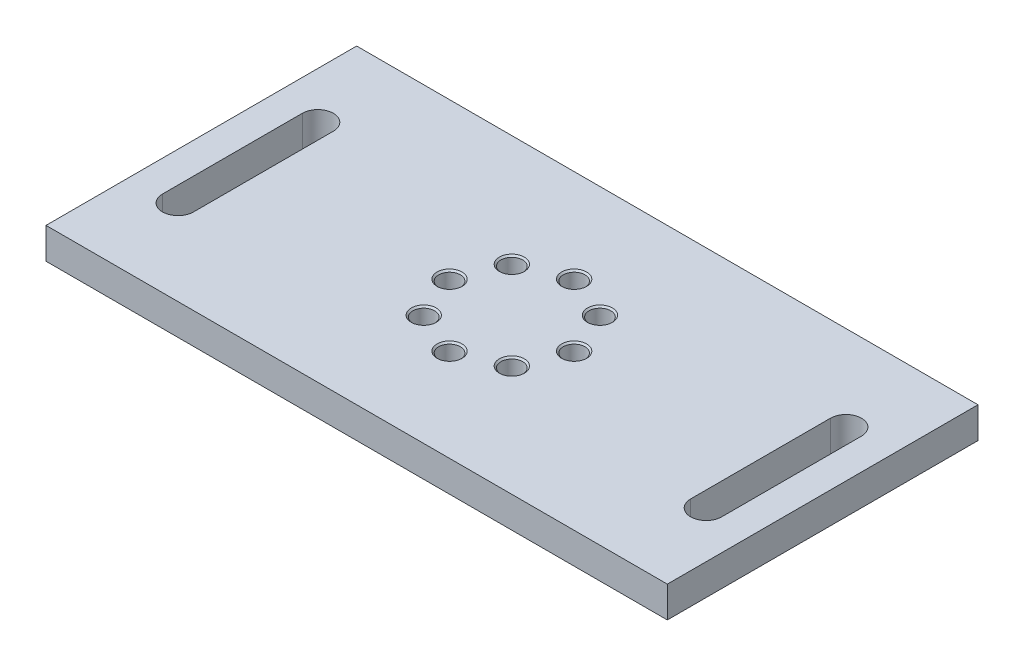
ISO-10303-21;
HEADER;
FILE_DESCRIPTION(('STEP AP214'),'2;1');
FILE_NAME('part.step','',(''),(''),'','','');
FILE_SCHEMA(('AUTOMOTIVE_DESIGN { 1 0 10303 214 1 1 1 1 }'));
ENDSEC;
DATA;
#1=APPLICATION_CONTEXT('core data for automotive mechanical design processes');
#2=APPLICATION_PROTOCOL_DEFINITION('international standard','automotive_design',2000,#1);
#3=PRODUCT_CONTEXT('',#1,'mechanical');
#4=PRODUCT('Part','Part','',(#3));
#5=PRODUCT_RELATED_PRODUCT_CATEGORY('part','',(#4));
#6=PRODUCT_DEFINITION_FORMATION('','',#4);
#7=PRODUCT_DEFINITION_CONTEXT('part definition',#1,'design');
#8=PRODUCT_DEFINITION('design','',#6,#7);
#9=PRODUCT_DEFINITION_SHAPE('','',#8);
#10=(LENGTH_UNIT() NAMED_UNIT(*) SI_UNIT(.MILLI.,.METRE.));
#11=(NAMED_UNIT(*) PLANE_ANGLE_UNIT() SI_UNIT($,.RADIAN.));
#12=(NAMED_UNIT(*) SI_UNIT($,.STERADIAN.) SOLID_ANGLE_UNIT());
#13=UNCERTAINTY_MEASURE_WITH_UNIT(LENGTH_MEASURE(1.E-05),#10,'distance_accuracy_value','');
#14=(GEOMETRIC_REPRESENTATION_CONTEXT(3) GLOBAL_UNCERTAINTY_ASSIGNED_CONTEXT((#13)) GLOBAL_UNIT_ASSIGNED_CONTEXT((#10,
#11,#12)) REPRESENTATION_CONTEXT('',''));
#15=CARTESIAN_POINT('',(0.,0.,0.));
#16=DIRECTION('',(0.,0.,1.));
#17=DIRECTION('',(1.,0.,0.));
#18=AXIS2_PLACEMENT_3D('',#15,#16,#17);
#19=CARTESIAN_POINT('',(0.,10.,0.));
#20=DIRECTION('',(1.,0.,0.));
#21=DIRECTION('',(0.,0.,-1.));
#22=AXIS2_PLACEMENT_3D('',#19,#20,#21);
#23=PLANE('',#22);
#24=DIRECTION('',(0.,0.,1.));
#25=VECTOR('',#24,1.);
#26=CARTESIAN_POINT('',(0.,0.,0.));
#27=LINE('',#26,#25);
#28=CARTESIAN_POINT('',(0.,0.,-100.));
#29=VERTEX_POINT('',#28);
#30=CARTESIAN_POINT('',(0.,0.,0.));
#31=VERTEX_POINT('',#30);
#32=EDGE_CURVE('E265',#29,#31,#27,.T.);
#33=ORIENTED_EDGE('',*,*,#32,.T.);
#34=DIRECTION('',(0.,-1.,0.));
#35=VECTOR('',#34,1.);
#36=CARTESIAN_POINT('',(0.,10.,0.));
#37=LINE('',#36,#35);
#38=CARTESIAN_POINT('',(0.,10.,0.));
#39=VERTEX_POINT('',#38);
#40=EDGE_CURVE('E11',#39,#31,#37,.T.);
#41=ORIENTED_EDGE('',*,*,#40,.F.);
#42=DIRECTION('',(0.,0.,1.));
#43=VECTOR('',#42,1.);
#44=CARTESIAN_POINT('',(0.,10.,0.));
#45=LINE('',#44,#43);
#46=CARTESIAN_POINT('',(0.,10.,-100.));
#47=VERTEX_POINT('',#46);
#48=EDGE_CURVE('E266',#47,#39,#45,.T.);
#49=ORIENTED_EDGE('',*,*,#48,.F.);
#50=DIRECTION('',(0.,-1.,0.));
#51=VECTOR('',#50,1.);
#52=CARTESIAN_POINT('',(0.,10.,-100.));
#53=LINE('',#52,#51);
#54=EDGE_CURVE('E276',#47,#29,#53,.T.);
#55=ORIENTED_EDGE('',*,*,#54,.T.);
#56=EDGE_LOOP('',(#33,#41,#49,#55));
#57=FACE_BOUND('',#56,.T.);
#58=ADVANCED_FACE('F36',(#57),#23,.F.);
#59=CARTESIAN_POINT('',(0.,10.,0.));
#60=DIRECTION('',(0.,0.,-1.));
#61=DIRECTION('',(-1.,0.,0.));
#62=AXIS2_PLACEMENT_3D('',#59,#60,#61);
#63=PLANE('',#62);
#64=DIRECTION('',(1.,0.,0.));
#65=VECTOR('',#64,1.);
#66=CARTESIAN_POINT('',(0.,0.,0.));
#67=LINE('',#66,#65);
#68=CARTESIAN_POINT('',(200.,0.,0.));
#69=VERTEX_POINT('',#68);
#70=EDGE_CURVE('E279',#31,#69,#67,.T.);
#71=ORIENTED_EDGE('',*,*,#70,.T.);
#72=DIRECTION('',(0.,-1.,0.));
#73=VECTOR('',#72,1.);
#74=CARTESIAN_POINT('',(200.,10.,0.));
#75=LINE('',#74,#73);
#76=CARTESIAN_POINT('',(200.,10.,0.));
#77=VERTEX_POINT('',#76);
#78=EDGE_CURVE('E43',#77,#69,#75,.T.);
#79=ORIENTED_EDGE('',*,*,#78,.F.);
#80=DIRECTION('',(1.,0.,0.));
#81=VECTOR('',#80,1.);
#82=CARTESIAN_POINT('',(0.,10.,0.));
#83=LINE('',#82,#81);
#84=EDGE_CURVE('E269',#39,#77,#83,.T.);
#85=ORIENTED_EDGE('',*,*,#84,.F.);
#86=ORIENTED_EDGE('',*,*,#40,.T.);
#87=EDGE_LOOP('',(#71,#79,#85,#86));
#88=FACE_BOUND('',#87,.T.);
#89=ADVANCED_FACE('F308',(#88),#63,.F.);
#90=CARTESIAN_POINT('',(200.,10.,0.));
#91=DIRECTION('',(-1.,0.,0.));
#92=DIRECTION('',(0.,0.,1.));
#93=AXIS2_PLACEMENT_3D('',#90,#91,#92);
#94=PLANE('',#93);
#95=DIRECTION('',(0.,0.,-1.));
#96=VECTOR('',#95,1.);
#97=CARTESIAN_POINT('',(200.,0.,0.));
#98=LINE('',#97,#96);
#99=CARTESIAN_POINT('',(200.,0.,-100.));
#100=VERTEX_POINT('',#99);
#101=EDGE_CURVE('E281',#69,#100,#98,.T.);
#102=ORIENTED_EDGE('',*,*,#101,.T.);
#103=DIRECTION('',(0.,-1.,0.));
#104=VECTOR('',#103,1.);
#105=CARTESIAN_POINT('',(200.,10.,-100.));
#106=LINE('',#105,#104);
#107=CARTESIAN_POINT('',(200.,10.,-100.));
#108=VERTEX_POINT('',#107);
#109=EDGE_CURVE('E286',#108,#100,#106,.T.);
#110=ORIENTED_EDGE('',*,*,#109,.F.);
#111=DIRECTION('',(0.,0.,-1.));
#112=VECTOR('',#111,1.);
#113=CARTESIAN_POINT('',(200.,10.,0.));
#114=LINE('',#113,#112);
#115=EDGE_CURVE('E272',#77,#108,#114,.T.);
#116=ORIENTED_EDGE('',*,*,#115,.F.);
#117=ORIENTED_EDGE('',*,*,#78,.T.);
#118=EDGE_LOOP('',(#102,#110,#116,#117));
#119=FACE_BOUND('',#118,.T.);
#120=ADVANCED_FACE('F293',(#119),#94,.F.);
#121=CARTESIAN_POINT('',(0.,10.,-100.));
#122=DIRECTION('',(0.,0.,1.));
#123=DIRECTION('',(1.,0.,0.));
#124=AXIS2_PLACEMENT_3D('',#121,#122,#123);
#125=PLANE('',#124);
#126=DIRECTION('',(-1.,0.,0.));
#127=VECTOR('',#126,1.);
#128=CARTESIAN_POINT('',(0.,0.,-100.));
#129=LINE('',#128,#127);
#130=EDGE_CURVE('E270',#100,#29,#129,.T.);
#131=ORIENTED_EDGE('',*,*,#130,.T.);
#132=ORIENTED_EDGE('',*,*,#54,.F.);
#133=DIRECTION('',(-1.,0.,0.));
#134=VECTOR('',#133,1.);
#135=CARTESIAN_POINT('',(0.,10.,-100.));
#136=LINE('',#135,#134);
#137=EDGE_CURVE('E274',#108,#47,#136,.T.);
#138=ORIENTED_EDGE('',*,*,#137,.F.);
#139=ORIENTED_EDGE('',*,*,#109,.T.);
#140=EDGE_LOOP('',(#131,#132,#138,#139));
#141=FACE_BOUND('',#140,.T.);
#142=ADVANCED_FACE('F301',(#141),#125,.F.);
#143=CARTESIAN_POINT('',(0.,10.,0.));
#144=DIRECTION('',(0.,-1.,0.));
#145=DIRECTION('',(0.,0.,-1.));
#146=AXIS2_PLACEMENT_3D('',#143,#144,#145);
#147=PLANE('',#146);
#148=DIRECTION('',(0.,0.,1.));
#149=VECTOR('',#148,1.);
#150=CARTESIAN_POINT('',(10.,10.,-72.5));
#151=LINE('',#150,#149);
#152=CARTESIAN_POINT('',(10.,10.,-72.5));
#153=VERTEX_POINT('',#152);
#154=CARTESIAN_POINT('',(10.,10.,-27.5));
#155=VERTEX_POINT('',#154);
#156=EDGE_CURVE('E154',#153,#155,#151,.T.);
#157=ORIENTED_EDGE('',*,*,#156,.F.);
#158=CARTESIAN_POINT('',(15.,10.,-72.5));
#159=DIRECTION('',(0.,1.,0.));
#160=DIRECTION('',(0.,0.,1.));
#161=AXIS2_PLACEMENT_3D('',#158,#159,#160);
#162=CIRCLE('',#161,5.);
#163=CARTESIAN_POINT('',(20.,10.,-72.5));
#164=VERTEX_POINT('',#163);
#165=EDGE_CURVE('E50',#164,#153,#162,.T.);
#166=ORIENTED_EDGE('',*,*,#165,.F.);
#167=DIRECTION('',(0.,0.,-1.));
#168=VECTOR('',#167,1.);
#169=CARTESIAN_POINT('',(20.,10.,-72.5));
#170=LINE('',#169,#168);
#171=CARTESIAN_POINT('',(20.,10.,-27.5));
#172=VERTEX_POINT('',#171);
#173=EDGE_CURVE('E145',#172,#164,#170,.T.);
#174=ORIENTED_EDGE('',*,*,#173,.F.);
#175=CARTESIAN_POINT('',(15.,10.,-27.5));
#176=DIRECTION('',(0.,1.,0.));
#177=DIRECTION('',(0.,0.,1.));
#178=AXIS2_PLACEMENT_3D('',#175,#176,#177);
#179=CIRCLE('',#178,5.);
#180=EDGE_CURVE('E148',#155,#172,#179,.T.);
#181=ORIENTED_EDGE('',*,*,#180,.F.);
#182=EDGE_LOOP('',(#157,#166,#174,#181));
#183=FACE_BOUND('',#182,.T.);
#184=DIRECTION('',(0.,0.,1.));
#185=VECTOR('',#184,1.);
#186=CARTESIAN_POINT('',(180.,10.,-72.4999999999999));
#187=LINE('',#186,#185);
#188=CARTESIAN_POINT('',(180.,10.,-72.4999999999999));
#189=VERTEX_POINT('',#188);
#190=CARTESIAN_POINT('',(180.,10.,-27.4999999999999));
#191=VERTEX_POINT('',#190);
#192=EDGE_CURVE('E180',#189,#191,#187,.T.);
#193=ORIENTED_EDGE('',*,*,#192,.F.);
#194=CARTESIAN_POINT('',(185.,10.,-72.4999999999999));
#195=DIRECTION('',(0.,1.,0.));
#196=DIRECTION('',(0.,0.,-1.));
#197=AXIS2_PLACEMENT_3D('',#194,#195,#196);
#198=CIRCLE('',#197,5.);
#199=CARTESIAN_POINT('',(190.,10.,-72.4999999999999));
#200=VERTEX_POINT('',#199);
#201=EDGE_CURVE('E58',#200,#189,#198,.T.);
#202=ORIENTED_EDGE('',*,*,#201,.F.);
#203=DIRECTION('',(0.,0.,-1.));
#204=VECTOR('',#203,1.);
#205=CARTESIAN_POINT('',(190.,10.,-72.4999999999999));
#206=LINE('',#205,#204);
#207=CARTESIAN_POINT('',(190.,10.,-27.4999999999999));
#208=VERTEX_POINT('',#207);
#209=EDGE_CURVE('E169',#208,#200,#206,.T.);
#210=ORIENTED_EDGE('',*,*,#209,.F.);
#211=CARTESIAN_POINT('',(185.,10.,-27.4999999999999));
#212=DIRECTION('',(0.,1.,0.));
#213=DIRECTION('',(0.,0.,-1.));
#214=AXIS2_PLACEMENT_3D('',#211,#212,#213);
#215=CIRCLE('',#214,5.);
#216=EDGE_CURVE('E183',#191,#208,#215,.T.);
#217=ORIENTED_EDGE('',*,*,#216,.F.);
#218=EDGE_LOOP('',(#193,#202,#210,#217));
#219=FACE_BOUND('',#218,.T.);
#220=CARTESIAN_POINT('',(114.178216181309,10.,-64.1271905674443));
#221=DIRECTION('',(0.,1.,0.));
#222=DIRECTION('',(0.,0.,1.));
#223=AXIS2_PLACEMENT_3D('',#220,#221,#222);
#224=CIRCLE('',#223,4.025);
#225=CARTESIAN_POINT('',(114.178216181309,10.,-60.1021905674443));
#226=VERTEX_POINT('',#225);
#227=EDGE_CURVE('E161',#226,#226,#224,.T.);
#228=ORIENTED_EDGE('',*,*,#227,.F.);
#229=EDGE_LOOP('',(#228));
#230=FACE_BOUND('',#229,.T.);
#231=CARTESIAN_POINT('',(120.051025613865,10.,-49.9489743861353));
#232=DIRECTION('',(0.,1.,0.));
#233=DIRECTION('',(0.,0.,1.));
#234=AXIS2_PLACEMENT_3D('',#231,#232,#233);
#235=CIRCLE('',#234,4.025);
#236=CARTESIAN_POINT('',(120.051025613865,10.,-45.9239743861353));
#237=VERTEX_POINT('',#236);
#238=EDGE_CURVE('E202',#237,#237,#235,.T.);
#239=ORIENTED_EDGE('',*,*,#238,.F.);
#240=EDGE_LOOP('',(#239));
#241=FACE_BOUND('',#240,.T.);
#242=CARTESIAN_POINT('',(114.178216181309,10.,-35.7707582048263));
#243=DIRECTION('',(0.,1.,0.));
#244=DIRECTION('',(0.,0.,1.));
#245=AXIS2_PLACEMENT_3D('',#242,#243,#244);
#246=CIRCLE('',#245,4.025);
#247=CARTESIAN_POINT('',(114.178216181309,10.,-31.7457582048263));
#248=VERTEX_POINT('',#247);
#249=EDGE_CURVE('E211',#248,#248,#246,.T.);
#250=ORIENTED_EDGE('',*,*,#249,.F.);
#251=EDGE_LOOP('',(#250));
#252=FACE_BOUND('',#251,.T.);
#253=CARTESIAN_POINT('',(100.,10.,-29.8979487722703));
#254=DIRECTION('',(0.,1.,0.));
#255=DIRECTION('',(0.,0.,1.));
#256=AXIS2_PLACEMENT_3D('',#253,#254,#255);
#257=CIRCLE('',#256,4.025);
#258=CARTESIAN_POINT('',(100.,10.,-25.8729487722703));
#259=VERTEX_POINT('',#258);
#260=EDGE_CURVE('E220',#259,#259,#257,.T.);
#261=ORIENTED_EDGE('',*,*,#260,.F.);
#262=EDGE_LOOP('',(#261));
#263=FACE_BOUND('',#262,.T.);
#264=CARTESIAN_POINT('',(85.821783818691,10.,-35.7707582048261));
#265=DIRECTION('',(0.,1.,0.));
#266=DIRECTION('',(0.,0.,1.));
#267=AXIS2_PLACEMENT_3D('',#264,#265,#266);
#268=CIRCLE('',#267,4.025);
#269=CARTESIAN_POINT('',(85.821783818691,10.,-31.7457582048261));
#270=VERTEX_POINT('',#269);
#271=EDGE_CURVE('E229',#270,#270,#268,.T.);
#272=ORIENTED_EDGE('',*,*,#271,.F.);
#273=EDGE_LOOP('',(#272));
#274=FACE_BOUND('',#273,.T.);
#275=CARTESIAN_POINT('',(79.9489743861351,10.,-49.9489743861351));
#276=DIRECTION('',(0.,1.,0.));
#277=DIRECTION('',(0.,0.,1.));
#278=AXIS2_PLACEMENT_3D('',#275,#276,#277);
#279=CIRCLE('',#278,4.025);
#280=CARTESIAN_POINT('',(79.9489743861351,10.,-45.9239743861351));
#281=VERTEX_POINT('',#280);
#282=EDGE_CURVE('E238',#281,#281,#279,.T.);
#283=ORIENTED_EDGE('',*,*,#282,.F.);
#284=EDGE_LOOP('',(#283));
#285=FACE_BOUND('',#284,.T.);
#286=CARTESIAN_POINT('',(85.821783818691,10.,-64.1271905674441));
#287=DIRECTION('',(0.,1.,0.));
#288=DIRECTION('',(0.,0.,1.));
#289=AXIS2_PLACEMENT_3D('',#286,#287,#288);
#290=CIRCLE('',#289,4.025);
#291=CARTESIAN_POINT('',(85.821783818691,10.,-60.1021905674441));
#292=VERTEX_POINT('',#291);
#293=EDGE_CURVE('E247',#292,#292,#290,.T.);
#294=ORIENTED_EDGE('',*,*,#293,.F.);
#295=EDGE_LOOP('',(#294));
#296=FACE_BOUND('',#295,.T.);
#297=CARTESIAN_POINT('',(100.,10.,-70.));
#298=DIRECTION('',(0.,1.,0.));
#299=DIRECTION('',(0.,0.,1.));
#300=AXIS2_PLACEMENT_3D('',#297,#298,#299);
#301=CIRCLE('',#300,4.025);
#302=CARTESIAN_POINT('',(100.,10.,-65.975));
#303=VERTEX_POINT('',#302);
#304=EDGE_CURVE('E256',#303,#303,#301,.T.);
#305=ORIENTED_EDGE('',*,*,#304,.F.);
#306=EDGE_LOOP('',(#305));
#307=FACE_BOUND('',#306,.T.);
#308=ORIENTED_EDGE('',*,*,#48,.T.);
#309=ORIENTED_EDGE('',*,*,#84,.T.);
#310=ORIENTED_EDGE('',*,*,#115,.T.);
#311=ORIENTED_EDGE('',*,*,#137,.T.);
#312=EDGE_LOOP('',(#308,#309,#310,#311));
#313=FACE_BOUND('',#312,.T.);
#314=ADVANCED_FACE('F307',(#183,#219,#230,#241,#252,#263,#274,#285,#296,#307,#313),#147,.F.);
#315=CARTESIAN_POINT('',(0.,0.,0.));
#316=DIRECTION('',(0.,-1.,0.));
#317=DIRECTION('',(0.,0.,-1.));
#318=AXIS2_PLACEMENT_3D('',#315,#316,#317);
#319=PLANE('',#318);
#320=CARTESIAN_POINT('',(15.,0.,-72.5));
#321=DIRECTION('',(0.,1.,0.));
#322=DIRECTION('',(0.,0.,1.));
#323=AXIS2_PLACEMENT_3D('',#320,#321,#322);
#324=CIRCLE('',#323,5.);
#325=CARTESIAN_POINT('',(20.,0.,-72.5));
#326=VERTEX_POINT('',#325);
#327=CARTESIAN_POINT('',(10.,0.,-72.5));
#328=VERTEX_POINT('',#327);
#329=EDGE_CURVE('E126',#326,#328,#324,.T.);
#330=ORIENTED_EDGE('',*,*,#329,.T.);
#331=DIRECTION('',(0.,0.,1.));
#332=VECTOR('',#331,1.);
#333=CARTESIAN_POINT('',(10.,0.,-72.5));
#334=LINE('',#333,#332);
#335=CARTESIAN_POINT('',(10.,0.,-27.5));
#336=VERTEX_POINT('',#335);
#337=EDGE_CURVE('E136',#328,#336,#334,.T.);
#338=ORIENTED_EDGE('',*,*,#337,.T.);
#339=CARTESIAN_POINT('',(15.,0.,-27.5));
#340=DIRECTION('',(0.,1.,0.));
#341=DIRECTION('',(0.,0.,1.));
#342=AXIS2_PLACEMENT_3D('',#339,#340,#341);
#343=CIRCLE('',#342,5.);
#344=CARTESIAN_POINT('',(20.,0.,-27.5));
#345=VERTEX_POINT('',#344);
#346=EDGE_CURVE('E140',#336,#345,#343,.T.);
#347=ORIENTED_EDGE('',*,*,#346,.T.);
#348=DIRECTION('',(0.,0.,-1.));
#349=VECTOR('',#348,1.);
#350=CARTESIAN_POINT('',(20.,0.,-72.5));
#351=LINE('',#350,#349);
#352=EDGE_CURVE('E132',#345,#326,#351,.T.);
#353=ORIENTED_EDGE('',*,*,#352,.T.);
#354=EDGE_LOOP('',(#330,#338,#347,#353));
#355=FACE_BOUND('',#354,.T.);
#356=CARTESIAN_POINT('',(185.,0.,-72.4999999999999));
#357=DIRECTION('',(0.,1.,0.));
#358=DIRECTION('',(0.,0.,-1.));
#359=AXIS2_PLACEMENT_3D('',#356,#357,#358);
#360=CIRCLE('',#359,5.);
#361=CARTESIAN_POINT('',(190.,0.,-72.4999999999999));
#362=VERTEX_POINT('',#361);
#363=CARTESIAN_POINT('',(180.,0.,-72.4999999999999));
#364=VERTEX_POINT('',#363);
#365=EDGE_CURVE('E165',#362,#364,#360,.T.);
#366=ORIENTED_EDGE('',*,*,#365,.T.);
#367=DIRECTION('',(0.,0.,1.));
#368=VECTOR('',#367,1.);
#369=CARTESIAN_POINT('',(180.,0.,-72.4999999999999));
#370=LINE('',#369,#368);
#371=CARTESIAN_POINT('',(180.,0.,-27.4999999999999));
#372=VERTEX_POINT('',#371);
#373=EDGE_CURVE('E168',#364,#372,#370,.T.);
#374=ORIENTED_EDGE('',*,*,#373,.T.);
#375=CARTESIAN_POINT('',(185.,0.,-27.4999999999999));
#376=DIRECTION('',(0.,1.,0.));
#377=DIRECTION('',(0.,0.,-1.));
#378=AXIS2_PLACEMENT_3D('',#375,#376,#377);
#379=CIRCLE('',#378,5.);
#380=CARTESIAN_POINT('',(190.,0.,-27.4999999999999));
#381=VERTEX_POINT('',#380);
#382=EDGE_CURVE('E172',#372,#381,#379,.T.);
#383=ORIENTED_EDGE('',*,*,#382,.T.);
#384=DIRECTION('',(0.,0.,-1.));
#385=VECTOR('',#384,1.);
#386=CARTESIAN_POINT('',(190.,0.,-72.4999999999999));
#387=LINE('',#386,#385);
#388=EDGE_CURVE('E175',#381,#362,#387,.T.);
#389=ORIENTED_EDGE('',*,*,#388,.T.);
#390=EDGE_LOOP('',(#366,#374,#383,#389));
#391=FACE_BOUND('',#390,.T.);
#392=CARTESIAN_POINT('',(114.178216181309,0.,-64.1271905674443));
#393=DIRECTION('',(0.,1.,0.));
#394=DIRECTION('',(0.,0.,1.));
#395=AXIS2_PLACEMENT_3D('',#392,#393,#394);
#396=CIRCLE('',#395,3.49999999999999);
#397=CARTESIAN_POINT('',(114.178216181309,0.,-60.6271905674443));
#398=VERTEX_POINT('',#397);
#399=EDGE_CURVE('E199',#398,#398,#396,.T.);
#400=ORIENTED_EDGE('',*,*,#399,.T.);
#401=EDGE_LOOP('',(#400));
#402=FACE_BOUND('',#401,.T.);
#403=CARTESIAN_POINT('',(120.051025613865,0.,-49.9489743861353));
#404=DIRECTION('',(0.,1.,0.));
#405=DIRECTION('',(0.,0.,1.));
#406=AXIS2_PLACEMENT_3D('',#403,#404,#405);
#407=CIRCLE('',#406,3.49999999999999);
#408=CARTESIAN_POINT('',(120.051025613865,0.,-46.4489743861353));
#409=VERTEX_POINT('',#408);
#410=EDGE_CURVE('E208',#409,#409,#407,.T.);
#411=ORIENTED_EDGE('',*,*,#410,.T.);
#412=EDGE_LOOP('',(#411));
#413=FACE_BOUND('',#412,.T.);
#414=CARTESIAN_POINT('',(114.178216181309,0.,-35.7707582048263));
#415=DIRECTION('',(0.,1.,0.));
#416=DIRECTION('',(0.,0.,1.));
#417=AXIS2_PLACEMENT_3D('',#414,#415,#416);
#418=CIRCLE('',#417,3.49999999999999);
#419=CARTESIAN_POINT('',(114.178216181309,0.,-32.2707582048263));
#420=VERTEX_POINT('',#419);
#421=EDGE_CURVE('E217',#420,#420,#418,.T.);
#422=ORIENTED_EDGE('',*,*,#421,.T.);
#423=EDGE_LOOP('',(#422));
#424=FACE_BOUND('',#423,.T.);
#425=CARTESIAN_POINT('',(100.,0.,-29.8979487722703));
#426=DIRECTION('',(0.,1.,0.));
#427=DIRECTION('',(0.,0.,1.));
#428=AXIS2_PLACEMENT_3D('',#425,#426,#427);
#429=CIRCLE('',#428,3.49999999999999);
#430=CARTESIAN_POINT('',(100.,0.,-26.3979487722703));
#431=VERTEX_POINT('',#430);
#432=EDGE_CURVE('E226',#431,#431,#429,.T.);
#433=ORIENTED_EDGE('',*,*,#432,.T.);
#434=EDGE_LOOP('',(#433));
#435=FACE_BOUND('',#434,.T.);
#436=CARTESIAN_POINT('',(85.821783818691,0.,-35.7707582048261));
#437=DIRECTION('',(0.,1.,0.));
#438=DIRECTION('',(0.,0.,1.));
#439=AXIS2_PLACEMENT_3D('',#436,#437,#438);
#440=CIRCLE('',#439,3.49999999999999);
#441=CARTESIAN_POINT('',(85.821783818691,0.,-32.2707582048261));
#442=VERTEX_POINT('',#441);
#443=EDGE_CURVE('E235',#442,#442,#440,.T.);
#444=ORIENTED_EDGE('',*,*,#443,.T.);
#445=EDGE_LOOP('',(#444));
#446=FACE_BOUND('',#445,.T.);
#447=CARTESIAN_POINT('',(79.9489743861351,0.,-49.9489743861351));
#448=DIRECTION('',(0.,1.,0.));
#449=DIRECTION('',(0.,0.,1.));
#450=AXIS2_PLACEMENT_3D('',#447,#448,#449);
#451=CIRCLE('',#450,3.49999999999999);
#452=CARTESIAN_POINT('',(79.9489743861351,0.,-46.4489743861351));
#453=VERTEX_POINT('',#452);
#454=EDGE_CURVE('E244',#453,#453,#451,.T.);
#455=ORIENTED_EDGE('',*,*,#454,.T.);
#456=EDGE_LOOP('',(#455));
#457=FACE_BOUND('',#456,.T.);
#458=CARTESIAN_POINT('',(85.821783818691,0.,-64.1271905674441));
#459=DIRECTION('',(0.,1.,0.));
#460=DIRECTION('',(0.,0.,1.));
#461=AXIS2_PLACEMENT_3D('',#458,#459,#460);
#462=CIRCLE('',#461,3.49999999999999);
#463=CARTESIAN_POINT('',(85.821783818691,0.,-60.6271905674441));
#464=VERTEX_POINT('',#463);
#465=EDGE_CURVE('E253',#464,#464,#462,.T.);
#466=ORIENTED_EDGE('',*,*,#465,.T.);
#467=EDGE_LOOP('',(#466));
#468=FACE_BOUND('',#467,.T.);
#469=CARTESIAN_POINT('',(100.,0.,-70.));
#470=DIRECTION('',(0.,1.,0.));
#471=DIRECTION('',(0.,0.,1.));
#472=AXIS2_PLACEMENT_3D('',#469,#470,#471);
#473=CIRCLE('',#472,3.49999999999999);
#474=CARTESIAN_POINT('',(100.,0.,-66.5));
#475=VERTEX_POINT('',#474);
#476=EDGE_CURVE('E262',#475,#475,#473,.T.);
#477=ORIENTED_EDGE('',*,*,#476,.T.);
#478=EDGE_LOOP('',(#477));
#479=FACE_BOUND('',#478,.T.);
#480=ORIENTED_EDGE('',*,*,#32,.F.);
#481=ORIENTED_EDGE('',*,*,#130,.F.);
#482=ORIENTED_EDGE('',*,*,#101,.F.);
#483=ORIENTED_EDGE('',*,*,#70,.F.);
#484=EDGE_LOOP('',(#480,#481,#482,#483));
#485=FACE_BOUND('',#484,.T.);
#486=ADVANCED_FACE('F142',(#355,#391,#402,#413,#424,#435,#446,#457,#468,#479,#485),#319,.T.);
#487=CARTESIAN_POINT('',(100.,10.,-70.));
#488=DIRECTION('',(0.,1.,0.));
#489=DIRECTION('',(0.,0.,1.));
#490=AXIS2_PLACEMENT_3D('',#487,#488,#489);
#491=CYLINDRICAL_SURFACE('',#490,3.5);
#492=ORIENTED_EDGE('',*,*,#476,.F.);
#493=EDGE_LOOP('',(#492));
#494=FACE_BOUND('',#493,.T.);
#495=CARTESIAN_POINT('',(100.,9.47499999999999,-70.));
#496=DIRECTION('',(0.,1.,0.));
#497=DIRECTION('',(0.,0.,1.));
#498=AXIS2_PLACEMENT_3D('',#495,#496,#497);
#499=CIRCLE('',#498,3.5);
#500=CARTESIAN_POINT('',(100.,9.47499999999999,-66.5));
#501=VERTEX_POINT('',#500);
#502=EDGE_CURVE('E259',#501,#501,#499,.T.);
#503=ORIENTED_EDGE('',*,*,#502,.T.);
#504=EDGE_LOOP('',(#503));
#505=FACE_BOUND('',#504,.T.);
#506=ADVANCED_FACE('F320',(#494,#505),#491,.F.);
#507=CARTESIAN_POINT('',(100.,10.,-70.));
#508=DIRECTION('',(0.,1.,0.));
#509=DIRECTION('',(0.,0.,1.));
#510=AXIS2_PLACEMENT_3D('',#507,#508,#509);
#511=CONICAL_SURFACE('',#510,4.025,0.785398163397437);
#512=ORIENTED_EDGE('',*,*,#502,.F.);
#513=EDGE_LOOP('',(#512));
#514=FACE_BOUND('',#513,.T.);
#515=ORIENTED_EDGE('',*,*,#304,.T.);
#516=EDGE_LOOP('',(#515));
#517=FACE_BOUND('',#516,.T.);
#518=ADVANCED_FACE('F326',(#514,#517),#511,.F.);
#519=CARTESIAN_POINT('',(85.821783818691,10.,-64.1271905674441));
#520=DIRECTION('',(0.,1.,0.));
#521=DIRECTION('',(0.,0.,1.));
#522=AXIS2_PLACEMENT_3D('',#519,#520,#521);
#523=CYLINDRICAL_SURFACE('',#522,3.5);
#524=ORIENTED_EDGE('',*,*,#465,.F.);
#525=EDGE_LOOP('',(#524));
#526=FACE_BOUND('',#525,.T.);
#527=CARTESIAN_POINT('',(85.821783818691,9.47499999999999,-64.1271905674441));
#528=DIRECTION('',(0.,1.,0.));
#529=DIRECTION('',(0.,0.,1.));
#530=AXIS2_PLACEMENT_3D('',#527,#528,#529);
#531=CIRCLE('',#530,3.5);
#532=CARTESIAN_POINT('',(85.821783818691,9.47499999999999,-60.6271905674441));
#533=VERTEX_POINT('',#532);
#534=EDGE_CURVE('E250',#533,#533,#531,.T.);
#535=ORIENTED_EDGE('',*,*,#534,.T.);
#536=EDGE_LOOP('',(#535));
#537=FACE_BOUND('',#536,.T.);
#538=ADVANCED_FACE('F330',(#526,#537),#523,.F.);
#539=CARTESIAN_POINT('',(85.821783818691,10.,-64.1271905674441));
#540=DIRECTION('',(0.,1.,0.));
#541=DIRECTION('',(0.,0.,1.));
#542=AXIS2_PLACEMENT_3D('',#539,#540,#541);
#543=CONICAL_SURFACE('',#542,4.025,0.785398163397437);
#544=ORIENTED_EDGE('',*,*,#534,.F.);
#545=EDGE_LOOP('',(#544));
#546=FACE_BOUND('',#545,.T.);
#547=ORIENTED_EDGE('',*,*,#293,.T.);
#548=EDGE_LOOP('',(#547));
#549=FACE_BOUND('',#548,.T.);
#550=ADVANCED_FACE('F334',(#546,#549),#543,.F.);
#551=CARTESIAN_POINT('',(79.9489743861351,10.,-49.9489743861351));
#552=DIRECTION('',(0.,1.,0.));
#553=DIRECTION('',(0.,0.,1.));
#554=AXIS2_PLACEMENT_3D('',#551,#552,#553);
#555=CYLINDRICAL_SURFACE('',#554,3.5);
#556=ORIENTED_EDGE('',*,*,#454,.F.);
#557=EDGE_LOOP('',(#556));
#558=FACE_BOUND('',#557,.T.);
#559=CARTESIAN_POINT('',(79.9489743861351,9.47499999999999,-49.9489743861351));
#560=DIRECTION('',(0.,1.,0.));
#561=DIRECTION('',(0.,0.,1.));
#562=AXIS2_PLACEMENT_3D('',#559,#560,#561);
#563=CIRCLE('',#562,3.5);
#564=CARTESIAN_POINT('',(79.9489743861351,9.47499999999999,-46.4489743861351));
#565=VERTEX_POINT('',#564);
#566=EDGE_CURVE('E241',#565,#565,#563,.T.);
#567=ORIENTED_EDGE('',*,*,#566,.T.);
#568=EDGE_LOOP('',(#567));
#569=FACE_BOUND('',#568,.T.);
#570=ADVANCED_FACE('F338',(#558,#569),#555,.F.);
#571=CARTESIAN_POINT('',(79.9489743861351,10.,-49.9489743861351));
#572=DIRECTION('',(0.,1.,0.));
#573=DIRECTION('',(0.,0.,1.));
#574=AXIS2_PLACEMENT_3D('',#571,#572,#573);
#575=CONICAL_SURFACE('',#574,4.025,0.785398163397437);
#576=ORIENTED_EDGE('',*,*,#566,.F.);
#577=EDGE_LOOP('',(#576));
#578=FACE_BOUND('',#577,.T.);
#579=ORIENTED_EDGE('',*,*,#282,.T.);
#580=EDGE_LOOP('',(#579));
#581=FACE_BOUND('',#580,.T.);
#582=ADVANCED_FACE('F342',(#578,#581),#575,.F.);
#583=CARTESIAN_POINT('',(85.821783818691,10.,-35.7707582048261));
#584=DIRECTION('',(0.,1.,0.));
#585=DIRECTION('',(0.,0.,1.));
#586=AXIS2_PLACEMENT_3D('',#583,#584,#585);
#587=CYLINDRICAL_SURFACE('',#586,3.5);
#588=ORIENTED_EDGE('',*,*,#443,.F.);
#589=EDGE_LOOP('',(#588));
#590=FACE_BOUND('',#589,.T.);
#591=CARTESIAN_POINT('',(85.821783818691,9.47499999999999,-35.7707582048261));
#592=DIRECTION('',(0.,1.,0.));
#593=DIRECTION('',(0.,0.,1.));
#594=AXIS2_PLACEMENT_3D('',#591,#592,#593);
#595=CIRCLE('',#594,3.5);
#596=CARTESIAN_POINT('',(85.821783818691,9.47499999999999,-32.2707582048261));
#597=VERTEX_POINT('',#596);
#598=EDGE_CURVE('E232',#597,#597,#595,.T.);
#599=ORIENTED_EDGE('',*,*,#598,.T.);
#600=EDGE_LOOP('',(#599));
#601=FACE_BOUND('',#600,.T.);
#602=ADVANCED_FACE('F346',(#590,#601),#587,.F.);
#603=CARTESIAN_POINT('',(85.821783818691,10.,-35.7707582048261));
#604=DIRECTION('',(0.,1.,0.));
#605=DIRECTION('',(0.,0.,1.));
#606=AXIS2_PLACEMENT_3D('',#603,#604,#605);
#607=CONICAL_SURFACE('',#606,4.025,0.785398163397437);
#608=ORIENTED_EDGE('',*,*,#598,.F.);
#609=EDGE_LOOP('',(#608));
#610=FACE_BOUND('',#609,.T.);
#611=ORIENTED_EDGE('',*,*,#271,.T.);
#612=EDGE_LOOP('',(#611));
#613=FACE_BOUND('',#612,.T.);
#614=ADVANCED_FACE('F350',(#610,#613),#607,.F.);
#615=CARTESIAN_POINT('',(100.,10.,-29.8979487722703));
#616=DIRECTION('',(0.,1.,0.));
#617=DIRECTION('',(0.,0.,1.));
#618=AXIS2_PLACEMENT_3D('',#615,#616,#617);
#619=CYLINDRICAL_SURFACE('',#618,3.5);
#620=ORIENTED_EDGE('',*,*,#432,.F.);
#621=EDGE_LOOP('',(#620));
#622=FACE_BOUND('',#621,.T.);
#623=CARTESIAN_POINT('',(100.,9.47499999999999,-29.8979487722703));
#624=DIRECTION('',(0.,1.,0.));
#625=DIRECTION('',(0.,0.,1.));
#626=AXIS2_PLACEMENT_3D('',#623,#624,#625);
#627=CIRCLE('',#626,3.5);
#628=CARTESIAN_POINT('',(100.,9.47499999999999,-26.3979487722703));
#629=VERTEX_POINT('',#628);
#630=EDGE_CURVE('E223',#629,#629,#627,.T.);
#631=ORIENTED_EDGE('',*,*,#630,.T.);
#632=EDGE_LOOP('',(#631));
#633=FACE_BOUND('',#632,.T.);
#634=ADVANCED_FACE('F354',(#622,#633),#619,.F.);
#635=CARTESIAN_POINT('',(100.,10.,-29.8979487722703));
#636=DIRECTION('',(0.,1.,0.));
#637=DIRECTION('',(0.,0.,1.));
#638=AXIS2_PLACEMENT_3D('',#635,#636,#637);
#639=CONICAL_SURFACE('',#638,4.025,0.785398163397437);
#640=ORIENTED_EDGE('',*,*,#630,.F.);
#641=EDGE_LOOP('',(#640));
#642=FACE_BOUND('',#641,.T.);
#643=ORIENTED_EDGE('',*,*,#260,.T.);
#644=EDGE_LOOP('',(#643));
#645=FACE_BOUND('',#644,.T.);
#646=ADVANCED_FACE('F358',(#642,#645),#639,.F.);
#647=CARTESIAN_POINT('',(114.178216181309,10.,-35.7707582048263));
#648=DIRECTION('',(0.,1.,0.));
#649=DIRECTION('',(0.,0.,1.));
#650=AXIS2_PLACEMENT_3D('',#647,#648,#649);
#651=CYLINDRICAL_SURFACE('',#650,3.5);
#652=ORIENTED_EDGE('',*,*,#421,.F.);
#653=EDGE_LOOP('',(#652));
#654=FACE_BOUND('',#653,.T.);
#655=CARTESIAN_POINT('',(114.178216181309,9.47499999999999,-35.7707582048263));
#656=DIRECTION('',(0.,1.,0.));
#657=DIRECTION('',(0.,0.,1.));
#658=AXIS2_PLACEMENT_3D('',#655,#656,#657);
#659=CIRCLE('',#658,3.5);
#660=CARTESIAN_POINT('',(114.178216181309,9.47499999999999,-32.2707582048263));
#661=VERTEX_POINT('',#660);
#662=EDGE_CURVE('E214',#661,#661,#659,.T.);
#663=ORIENTED_EDGE('',*,*,#662,.T.);
#664=EDGE_LOOP('',(#663));
#665=FACE_BOUND('',#664,.T.);
#666=ADVANCED_FACE('F362',(#654,#665),#651,.F.);
#667=CARTESIAN_POINT('',(114.178216181309,10.,-35.7707582048263));
#668=DIRECTION('',(0.,1.,0.));
#669=DIRECTION('',(0.,0.,1.));
#670=AXIS2_PLACEMENT_3D('',#667,#668,#669);
#671=CONICAL_SURFACE('',#670,4.025,0.785398163397437);
#672=ORIENTED_EDGE('',*,*,#662,.F.);
#673=EDGE_LOOP('',(#672));
#674=FACE_BOUND('',#673,.T.);
#675=ORIENTED_EDGE('',*,*,#249,.T.);
#676=EDGE_LOOP('',(#675));
#677=FACE_BOUND('',#676,.T.);
#678=ADVANCED_FACE('F366',(#674,#677),#671,.F.);
#679=CARTESIAN_POINT('',(120.051025613865,10.,-49.9489743861353));
#680=DIRECTION('',(0.,1.,0.));
#681=DIRECTION('',(0.,0.,1.));
#682=AXIS2_PLACEMENT_3D('',#679,#680,#681);
#683=CYLINDRICAL_SURFACE('',#682,3.5);
#684=ORIENTED_EDGE('',*,*,#410,.F.);
#685=EDGE_LOOP('',(#684));
#686=FACE_BOUND('',#685,.T.);
#687=CARTESIAN_POINT('',(120.051025613865,9.47499999999999,-49.9489743861353));
#688=DIRECTION('',(0.,1.,0.));
#689=DIRECTION('',(0.,0.,1.));
#690=AXIS2_PLACEMENT_3D('',#687,#688,#689);
#691=CIRCLE('',#690,3.5);
#692=CARTESIAN_POINT('',(120.051025613865,9.47499999999999,-46.4489743861353));
#693=VERTEX_POINT('',#692);
#694=EDGE_CURVE('E205',#693,#693,#691,.T.);
#695=ORIENTED_EDGE('',*,*,#694,.T.);
#696=EDGE_LOOP('',(#695));
#697=FACE_BOUND('',#696,.T.);
#698=ADVANCED_FACE('F370',(#686,#697),#683,.F.);
#699=CARTESIAN_POINT('',(120.051025613865,10.,-49.9489743861353));
#700=DIRECTION('',(0.,1.,0.));
#701=DIRECTION('',(0.,0.,1.));
#702=AXIS2_PLACEMENT_3D('',#699,#700,#701);
#703=CONICAL_SURFACE('',#702,4.025,0.785398163397437);
#704=ORIENTED_EDGE('',*,*,#694,.F.);
#705=EDGE_LOOP('',(#704));
#706=FACE_BOUND('',#705,.T.);
#707=ORIENTED_EDGE('',*,*,#238,.T.);
#708=EDGE_LOOP('',(#707));
#709=FACE_BOUND('',#708,.T.);
#710=ADVANCED_FACE('F374',(#706,#709),#703,.F.);
#711=CARTESIAN_POINT('',(114.178216181309,10.,-64.1271905674443));
#712=DIRECTION('',(0.,1.,0.));
#713=DIRECTION('',(0.,0.,1.));
#714=AXIS2_PLACEMENT_3D('',#711,#712,#713);
#715=CYLINDRICAL_SURFACE('',#714,3.5);
#716=ORIENTED_EDGE('',*,*,#399,.F.);
#717=EDGE_LOOP('',(#716));
#718=FACE_BOUND('',#717,.T.);
#719=CARTESIAN_POINT('',(114.178216181309,9.47499999999999,-64.1271905674443));
#720=DIRECTION('',(0.,1.,0.));
#721=DIRECTION('',(0.,0.,1.));
#722=AXIS2_PLACEMENT_3D('',#719,#720,#721);
#723=CIRCLE('',#722,3.5);
#724=CARTESIAN_POINT('',(114.178216181309,9.47499999999999,-60.6271905674443));
#725=VERTEX_POINT('',#724);
#726=EDGE_CURVE('E196',#725,#725,#723,.T.);
#727=ORIENTED_EDGE('',*,*,#726,.T.);
#728=EDGE_LOOP('',(#727));
#729=FACE_BOUND('',#728,.T.);
#730=ADVANCED_FACE('F378',(#718,#729),#715,.F.);
#731=CARTESIAN_POINT('',(114.178216181309,10.,-64.1271905674443));
#732=DIRECTION('',(0.,1.,0.));
#733=DIRECTION('',(0.,0.,1.));
#734=AXIS2_PLACEMENT_3D('',#731,#732,#733);
#735=CONICAL_SURFACE('',#734,4.025,0.785398163397437);
#736=ORIENTED_EDGE('',*,*,#726,.F.);
#737=EDGE_LOOP('',(#736));
#738=FACE_BOUND('',#737,.T.);
#739=ORIENTED_EDGE('',*,*,#227,.T.);
#740=EDGE_LOOP('',(#739));
#741=FACE_BOUND('',#740,.T.);
#742=ADVANCED_FACE('F382',(#738,#741),#735,.F.);
#743=CARTESIAN_POINT('',(185.,0.,-72.4999999999999));
#744=DIRECTION('',(0.,1.,0.));
#745=DIRECTION('',(0.,0.,1.));
#746=AXIS2_PLACEMENT_3D('',#743,#744,#745);
#747=CYLINDRICAL_SURFACE('',#746,5.);
#748=ORIENTED_EDGE('',*,*,#201,.T.);
#749=DIRECTION('',(0.,1.,0.));
#750=VECTOR('',#749,1.);
#751=CARTESIAN_POINT('',(180.,0.,-72.4999999999999));
#752=LINE('',#751,#750);
#753=EDGE_CURVE('E178',#364,#189,#752,.T.);
#754=ORIENTED_EDGE('',*,*,#753,.F.);
#755=ORIENTED_EDGE('',*,*,#365,.F.);
#756=DIRECTION('',(0.,1.,0.));
#757=VECTOR('',#756,1.);
#758=CARTESIAN_POINT('',(190.,0.,-72.4999999999999));
#759=LINE('',#758,#757);
#760=EDGE_CURVE('E155',#362,#200,#759,.T.);
#761=ORIENTED_EDGE('',*,*,#760,.T.);
#762=EDGE_LOOP('',(#748,#754,#755,#761));
#763=FACE_BOUND('',#762,.T.);
#764=ADVANCED_FACE('F386',(#763),#747,.F.);
#765=CARTESIAN_POINT('',(190.,0.,-72.4999999999999));
#766=DIRECTION('',(1.,0.,0.));
#767=DIRECTION('',(0.,0.,-1.));
#768=AXIS2_PLACEMENT_3D('',#765,#766,#767);
#769=PLANE('',#768);
#770=ORIENTED_EDGE('',*,*,#209,.T.);
#771=ORIENTED_EDGE('',*,*,#760,.F.);
#772=ORIENTED_EDGE('',*,*,#388,.F.);
#773=DIRECTION('',(0.,1.,0.));
#774=VECTOR('',#773,1.);
#775=CARTESIAN_POINT('',(190.,0.,-27.4999999999999));
#776=LINE('',#775,#774);
#777=EDGE_CURVE('E189',#381,#208,#776,.T.);
#778=ORIENTED_EDGE('',*,*,#777,.T.);
#779=EDGE_LOOP('',(#770,#771,#772,#778));
#780=FACE_BOUND('',#779,.T.);
#781=ADVANCED_FACE('F390',(#780),#769,.F.);
#782=CARTESIAN_POINT('',(185.,0.,-27.4999999999999));
#783=DIRECTION('',(0.,1.,0.));
#784=DIRECTION('',(0.,0.,1.));
#785=AXIS2_PLACEMENT_3D('',#782,#783,#784);
#786=CYLINDRICAL_SURFACE('',#785,5.);
#787=ORIENTED_EDGE('',*,*,#216,.T.);
#788=ORIENTED_EDGE('',*,*,#777,.F.);
#789=ORIENTED_EDGE('',*,*,#382,.F.);
#790=DIRECTION('',(0.,1.,0.));
#791=VECTOR('',#790,1.);
#792=CARTESIAN_POINT('',(180.,0.,-27.4999999999999));
#793=LINE('',#792,#791);
#794=EDGE_CURVE('E191',#372,#191,#793,.T.);
#795=ORIENTED_EDGE('',*,*,#794,.T.);
#796=EDGE_LOOP('',(#787,#788,#789,#795));
#797=FACE_BOUND('',#796,.T.);
#798=ADVANCED_FACE('F394',(#797),#786,.F.);
#799=CARTESIAN_POINT('',(180.,0.,-72.4999999999999));
#800=DIRECTION('',(-1.,0.,0.));
#801=DIRECTION('',(0.,0.,1.));
#802=AXIS2_PLACEMENT_3D('',#799,#800,#801);
#803=PLANE('',#802);
#804=ORIENTED_EDGE('',*,*,#192,.T.);
#805=ORIENTED_EDGE('',*,*,#794,.F.);
#806=ORIENTED_EDGE('',*,*,#373,.F.);
#807=ORIENTED_EDGE('',*,*,#753,.T.);
#808=EDGE_LOOP('',(#804,#805,#806,#807));
#809=FACE_BOUND('',#808,.T.);
#810=ADVANCED_FACE('F391',(#809),#803,.F.);
#811=CARTESIAN_POINT('',(15.,0.,-72.5));
#812=DIRECTION('',(0.,1.,0.));
#813=DIRECTION('',(0.,0.,1.));
#814=AXIS2_PLACEMENT_3D('',#811,#812,#813);
#815=CYLINDRICAL_SURFACE('',#814,5.);
#816=ORIENTED_EDGE('',*,*,#165,.T.);
#817=DIRECTION('',(0.,1.,0.));
#818=VECTOR('',#817,1.);
#819=CARTESIAN_POINT('',(10.,0.,-72.5));
#820=LINE('',#819,#818);
#821=EDGE_CURVE('E122',#328,#153,#820,.T.);
#822=ORIENTED_EDGE('',*,*,#821,.F.);
#823=ORIENTED_EDGE('',*,*,#329,.F.);
#824=DIRECTION('',(0.,1.,0.));
#825=VECTOR('',#824,1.);
#826=CARTESIAN_POINT('',(20.,0.,-72.5));
#827=LINE('',#826,#825);
#828=EDGE_CURVE('E159',#326,#164,#827,.T.);
#829=ORIENTED_EDGE('',*,*,#828,.T.);
#830=EDGE_LOOP('',(#816,#822,#823,#829));
#831=FACE_BOUND('',#830,.T.);
#832=ADVANCED_FACE('F124',(#831),#815,.F.);
#833=CARTESIAN_POINT('',(20.,0.,-72.5));
#834=DIRECTION('',(1.,0.,0.));
#835=DIRECTION('',(0.,0.,-1.));
#836=AXIS2_PLACEMENT_3D('',#833,#834,#835);
#837=PLANE('',#836);
#838=ORIENTED_EDGE('',*,*,#173,.T.);
#839=ORIENTED_EDGE('',*,*,#828,.F.);
#840=ORIENTED_EDGE('',*,*,#352,.F.);
#841=DIRECTION('',(0.,1.,0.));
#842=VECTOR('',#841,1.);
#843=CARTESIAN_POINT('',(20.,0.,-27.5));
#844=LINE('',#843,#842);
#845=EDGE_CURVE('E162',#345,#172,#844,.T.);
#846=ORIENTED_EDGE('',*,*,#845,.T.);
#847=EDGE_LOOP('',(#838,#839,#840,#846));
#848=FACE_BOUND('',#847,.T.);
#849=ADVANCED_FACE('F404',(#848),#837,.F.);
#850=CARTESIAN_POINT('',(15.,0.,-27.5));
#851=DIRECTION('',(0.,1.,0.));
#852=DIRECTION('',(0.,0.,1.));
#853=AXIS2_PLACEMENT_3D('',#850,#851,#852);
#854=CYLINDRICAL_SURFACE('',#853,5.);
#855=ORIENTED_EDGE('',*,*,#180,.T.);
#856=ORIENTED_EDGE('',*,*,#845,.F.);
#857=ORIENTED_EDGE('',*,*,#346,.F.);
#858=DIRECTION('',(0.,1.,0.));
#859=VECTOR('',#858,1.);
#860=CARTESIAN_POINT('',(10.,0.,-27.5));
#861=LINE('',#860,#859);
#862=EDGE_CURVE('E131',#336,#155,#861,.T.);
#863=ORIENTED_EDGE('',*,*,#862,.T.);
#864=EDGE_LOOP('',(#855,#856,#857,#863));
#865=FACE_BOUND('',#864,.T.);
#866=ADVANCED_FACE('F407',(#865),#854,.F.);
#867=CARTESIAN_POINT('',(10.,0.,-72.5));
#868=DIRECTION('',(-1.,0.,0.));
#869=DIRECTION('',(0.,0.,1.));
#870=AXIS2_PLACEMENT_3D('',#867,#868,#869);
#871=PLANE('',#870);
#872=ORIENTED_EDGE('',*,*,#156,.T.);
#873=ORIENTED_EDGE('',*,*,#862,.F.);
#874=ORIENTED_EDGE('',*,*,#337,.F.);
#875=ORIENTED_EDGE('',*,*,#821,.T.);
#876=EDGE_LOOP('',(#872,#873,#874,#875));
#877=FACE_BOUND('',#876,.T.);
#878=ADVANCED_FACE('F137',(#877),#871,.F.);
#879=CLOSED_SHELL('',(#58,#89,#120,#142,#314,#486,#506,#518,#538,#550,#570,#582,#602,#614,#634,
#646,#666,#678,#698,#710,#730,#742,#764,#781,#798,#810,#832,#849,#866,#878));
#880=MANIFOLD_SOLID_BREP('B2',#879);
#881=ADVANCED_BREP_SHAPE_REPRESENTATION('',(#18,#880),#14);
#882=SHAPE_DEFINITION_REPRESENTATION(#9,#881);
ENDSEC;
END-ISO-10303-21;
